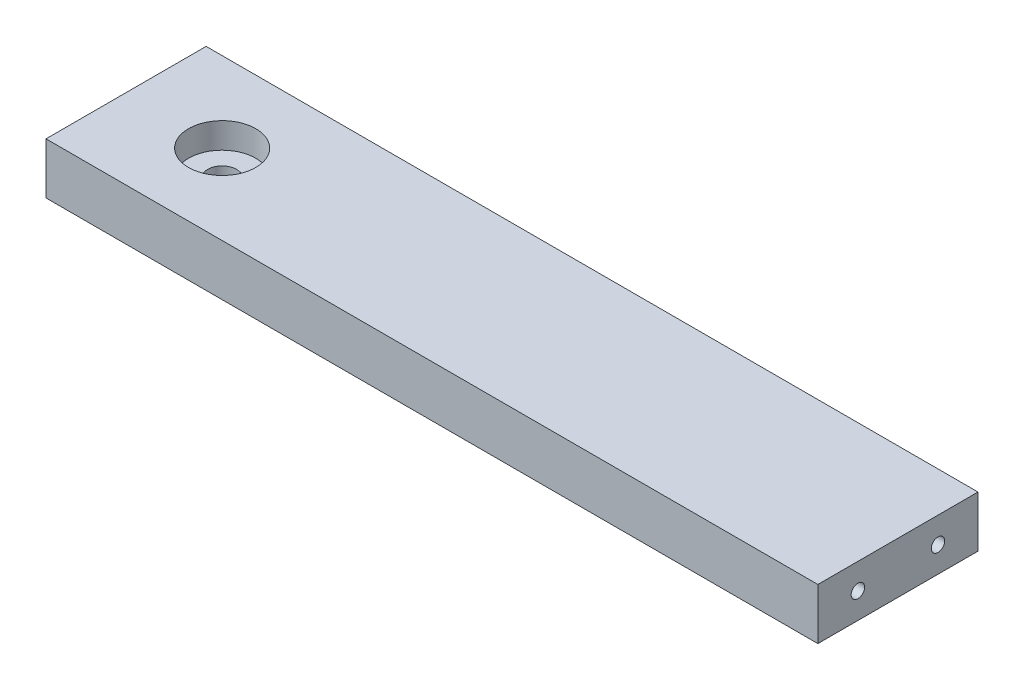
ISO-10303-21;
HEADER;
FILE_DESCRIPTION(('STEP AP214'),'2;1');
FILE_NAME('part.step','',(''),(''),'','','');
FILE_SCHEMA(('AUTOMOTIVE_DESIGN { 1 0 10303 214 1 1 1 1 }'));
ENDSEC;
DATA;
#1=APPLICATION_CONTEXT('core data for automotive mechanical design processes');
#2=APPLICATION_PROTOCOL_DEFINITION('international standard','automotive_design',2000,#1);
#3=PRODUCT_CONTEXT('',#1,'mechanical');
#4=PRODUCT('Part','Part','',(#3));
#5=PRODUCT_RELATED_PRODUCT_CATEGORY('part','',(#4));
#6=PRODUCT_DEFINITION_FORMATION('','',#4);
#7=PRODUCT_DEFINITION_CONTEXT('part definition',#1,'design');
#8=PRODUCT_DEFINITION('design','',#6,#7);
#9=PRODUCT_DEFINITION_SHAPE('','',#8);
#10=(LENGTH_UNIT() NAMED_UNIT(*) SI_UNIT(.MILLI.,.METRE.));
#11=(NAMED_UNIT(*) PLANE_ANGLE_UNIT() SI_UNIT($,.RADIAN.));
#12=(NAMED_UNIT(*) SI_UNIT($,.STERADIAN.) SOLID_ANGLE_UNIT());
#13=UNCERTAINTY_MEASURE_WITH_UNIT(LENGTH_MEASURE(1.E-05),#10,'distance_accuracy_value','');
#14=(GEOMETRIC_REPRESENTATION_CONTEXT(3) GLOBAL_UNCERTAINTY_ASSIGNED_CONTEXT((#13)) GLOBAL_UNIT_ASSIGNED_CONTEXT((#10,
#11,#12)) REPRESENTATION_CONTEXT('',''));
#15=CARTESIAN_POINT('',(0.,0.,0.));
#16=DIRECTION('',(0.,0.,1.));
#17=DIRECTION('',(1.,0.,0.));
#18=AXIS2_PLACEMENT_3D('',#15,#16,#17);
#19=CARTESIAN_POINT('',(-120.5,16.,25.));
#20=DIRECTION('',(1.,0.,0.));
#21=DIRECTION('',(0.,0.,-1.));
#22=AXIS2_PLACEMENT_3D('',#19,#20,#21);
#23=PLANE('',#22);
#24=DIRECTION('',(0.,0.,1.));
#25=VECTOR('',#24,1.);
#26=CARTESIAN_POINT('',(-120.5,0.,25.));
#27=LINE('',#26,#25);
#28=CARTESIAN_POINT('',(-120.5,0.,-25.));
#29=VERTEX_POINT('',#28);
#30=CARTESIAN_POINT('',(-120.5,0.,25.));
#31=VERTEX_POINT('',#30);
#32=EDGE_CURVE('E120',#29,#31,#27,.T.);
#33=ORIENTED_EDGE('',*,*,#32,.T.);
#34=DIRECTION('',(0.,-1.,0.));
#35=VECTOR('',#34,1.);
#36=CARTESIAN_POINT('',(-120.5,16.,25.));
#37=LINE('',#36,#35);
#38=CARTESIAN_POINT('',(-120.5,16.,25.));
#39=VERTEX_POINT('',#38);
#40=EDGE_CURVE('E11',#39,#31,#37,.T.);
#41=ORIENTED_EDGE('',*,*,#40,.F.);
#42=DIRECTION('',(0.,0.,1.));
#43=VECTOR('',#42,1.);
#44=CARTESIAN_POINT('',(-120.5,16.,25.));
#45=LINE('',#44,#43);
#46=CARTESIAN_POINT('',(-120.5,16.,-25.));
#47=VERTEX_POINT('',#46);
#48=EDGE_CURVE('E123',#47,#39,#45,.T.);
#49=ORIENTED_EDGE('',*,*,#48,.F.);
#50=DIRECTION('',(0.,-1.,0.));
#51=VECTOR('',#50,1.);
#52=CARTESIAN_POINT('',(-120.5,16.,-25.));
#53=LINE('',#52,#51);
#54=EDGE_CURVE('E129',#47,#29,#53,.T.);
#55=ORIENTED_EDGE('',*,*,#54,.T.);
#56=EDGE_LOOP('',(#33,#41,#49,#55));
#57=FACE_BOUND('',#56,.T.);
#58=ADVANCED_FACE('F35',(#57),#23,.F.);
#59=CARTESIAN_POINT('',(120.5,16.,25.));
#60=DIRECTION('',(0.,0.,-1.));
#61=DIRECTION('',(-1.,0.,0.));
#62=AXIS2_PLACEMENT_3D('',#59,#60,#61);
#63=PLANE('',#62);
#64=DIRECTION('',(1.,0.,0.));
#65=VECTOR('',#64,1.);
#66=CARTESIAN_POINT('',(120.5,0.,25.));
#67=LINE('',#66,#65);
#68=CARTESIAN_POINT('',(120.5,0.,25.));
#69=VERTEX_POINT('',#68);
#70=EDGE_CURVE('E132',#31,#69,#67,.T.);
#71=ORIENTED_EDGE('',*,*,#70,.T.);
#72=DIRECTION('',(0.,-1.,0.));
#73=VECTOR('',#72,1.);
#74=CARTESIAN_POINT('',(120.5,16.,25.));
#75=LINE('',#74,#73);
#76=CARTESIAN_POINT('',(120.5,16.,25.));
#77=VERTEX_POINT('',#76);
#78=EDGE_CURVE('E43',#77,#69,#75,.T.);
#79=ORIENTED_EDGE('',*,*,#78,.F.);
#80=DIRECTION('',(1.,0.,0.));
#81=VECTOR('',#80,1.);
#82=CARTESIAN_POINT('',(120.5,16.,25.));
#83=LINE('',#82,#81);
#84=EDGE_CURVE('E82',#39,#77,#83,.T.);
#85=ORIENTED_EDGE('',*,*,#84,.F.);
#86=ORIENTED_EDGE('',*,*,#40,.T.);
#87=EDGE_LOOP('',(#71,#79,#85,#86));
#88=FACE_BOUND('',#87,.T.);
#89=ADVANCED_FACE('F156',(#88),#63,.F.);
#90=CARTESIAN_POINT('',(120.5,16.,25.));
#91=DIRECTION('',(-1.,0.,0.));
#92=DIRECTION('',(0.,0.,1.));
#93=AXIS2_PLACEMENT_3D('',#90,#91,#92);
#94=PLANE('',#93);
#95=CARTESIAN_POINT('',(120.5,8.,12.5));
#96=DIRECTION('',(1.,0.,0.));
#97=DIRECTION('',(0.,0.,-1.));
#98=AXIS2_PLACEMENT_3D('',#95,#96,#97);
#99=CIRCLE('',#98,2.09999999999999);
#100=CARTESIAN_POINT('',(120.5,8.,10.4));
#101=VERTEX_POINT('',#100);
#102=EDGE_CURVE('E100',#101,#101,#99,.T.);
#103=ORIENTED_EDGE('',*,*,#102,.F.);
#104=EDGE_LOOP('',(#103));
#105=FACE_BOUND('',#104,.T.);
#106=CARTESIAN_POINT('',(120.5,8.00000000000001,-12.5));
#107=DIRECTION('',(1.,0.,0.));
#108=DIRECTION('',(0.,0.,-1.));
#109=AXIS2_PLACEMENT_3D('',#106,#107,#108);
#110=CIRCLE('',#109,2.09999999999999);
#111=CARTESIAN_POINT('',(120.5,8.00000000000001,-14.6));
#112=VERTEX_POINT('',#111);
#113=EDGE_CURVE('E99',#112,#112,#110,.T.);
#114=ORIENTED_EDGE('',*,*,#113,.F.);
#115=EDGE_LOOP('',(#114));
#116=FACE_BOUND('',#115,.T.);
#117=DIRECTION('',(0.,0.,-1.));
#118=VECTOR('',#117,1.);
#119=CARTESIAN_POINT('',(120.5,0.,25.));
#120=LINE('',#119,#118);
#121=CARTESIAN_POINT('',(120.5,0.,-25.));
#122=VERTEX_POINT('',#121);
#123=EDGE_CURVE('E69',#69,#122,#120,.T.);
#124=ORIENTED_EDGE('',*,*,#123,.T.);
#125=DIRECTION('',(0.,-1.,0.));
#126=VECTOR('',#125,1.);
#127=CARTESIAN_POINT('',(120.5,16.,-25.));
#128=LINE('',#127,#126);
#129=CARTESIAN_POINT('',(120.5,16.,-25.));
#130=VERTEX_POINT('',#129);
#131=EDGE_CURVE('E137',#130,#122,#128,.T.);
#132=ORIENTED_EDGE('',*,*,#131,.F.);
#133=DIRECTION('',(0.,0.,-1.));
#134=VECTOR('',#133,1.);
#135=CARTESIAN_POINT('',(120.5,16.,25.));
#136=LINE('',#135,#134);
#137=EDGE_CURVE('E126',#77,#130,#136,.T.);
#138=ORIENTED_EDGE('',*,*,#137,.F.);
#139=ORIENTED_EDGE('',*,*,#78,.T.);
#140=EDGE_LOOP('',(#124,#132,#138,#139));
#141=FACE_BOUND('',#140,.T.);
#142=ADVANCED_FACE('F139',(#105,#116,#141),#94,.F.);
#143=CARTESIAN_POINT('',(120.5,16.,-25.));
#144=DIRECTION('',(0.,0.,1.));
#145=DIRECTION('',(1.,0.,0.));
#146=AXIS2_PLACEMENT_3D('',#143,#144,#145);
#147=PLANE('',#146);
#148=DIRECTION('',(-1.,0.,0.));
#149=VECTOR('',#148,1.);
#150=CARTESIAN_POINT('',(120.5,0.,-25.));
#151=LINE('',#150,#149);
#152=EDGE_CURVE('E75',#122,#29,#151,.T.);
#153=ORIENTED_EDGE('',*,*,#152,.T.);
#154=ORIENTED_EDGE('',*,*,#54,.F.);
#155=DIRECTION('',(-1.,0.,0.));
#156=VECTOR('',#155,1.);
#157=CARTESIAN_POINT('',(120.5,16.,-25.));
#158=LINE('',#157,#156);
#159=EDGE_CURVE('E51',#130,#47,#158,.T.);
#160=ORIENTED_EDGE('',*,*,#159,.F.);
#161=ORIENTED_EDGE('',*,*,#131,.T.);
#162=EDGE_LOOP('',(#153,#154,#160,#161));
#163=FACE_BOUND('',#162,.T.);
#164=ADVANCED_FACE('F146',(#163),#147,.F.);
#165=CARTESIAN_POINT('',(0.,16.,0.));
#166=DIRECTION('',(0.,1.,0.));
#167=DIRECTION('',(0.,0.,1.));
#168=AXIS2_PLACEMENT_3D('',#165,#166,#167);
#169=PLANE('',#168);
#170=CARTESIAN_POINT('',(-90.5,16.,0.));
#171=DIRECTION('',(0.,1.,0.));
#172=DIRECTION('',(0.,0.,1.));
#173=AXIS2_PLACEMENT_3D('',#170,#171,#172);
#174=CIRCLE('',#173,10.5);
#175=CARTESIAN_POINT('',(-90.5,16.,10.5));
#176=VERTEX_POINT('',#175);
#177=EDGE_CURVE('E114',#176,#176,#174,.T.);
#178=ORIENTED_EDGE('',*,*,#177,.F.);
#179=EDGE_LOOP('',(#178));
#180=FACE_BOUND('',#179,.T.);
#181=ORIENTED_EDGE('',*,*,#48,.T.);
#182=ORIENTED_EDGE('',*,*,#84,.T.);
#183=ORIENTED_EDGE('',*,*,#137,.T.);
#184=ORIENTED_EDGE('',*,*,#159,.T.);
#185=EDGE_LOOP('',(#181,#182,#183,#184));
#186=FACE_BOUND('',#185,.T.);
#187=ADVANCED_FACE('F148',(#180,#186),#169,.T.);
#188=CARTESIAN_POINT('',(0.,0.,0.));
#189=DIRECTION('',(0.,1.,0.));
#190=DIRECTION('',(0.,0.,1.));
#191=AXIS2_PLACEMENT_3D('',#188,#189,#190);
#192=PLANE('',#191);
#193=CARTESIAN_POINT('',(-90.5,0.,0.));
#194=DIRECTION('',(0.,1.,0.));
#195=DIRECTION('',(0.,0.,1.));
#196=AXIS2_PLACEMENT_3D('',#193,#194,#195);
#197=CIRCLE('',#196,4.5);
#198=CARTESIAN_POINT('',(-90.5,0.,4.49999999999999));
#199=VERTEX_POINT('',#198);
#200=EDGE_CURVE('E111',#199,#199,#197,.T.);
#201=ORIENTED_EDGE('',*,*,#200,.T.);
#202=EDGE_LOOP('',(#201));
#203=FACE_BOUND('',#202,.T.);
#204=ORIENTED_EDGE('',*,*,#32,.F.);
#205=ORIENTED_EDGE('',*,*,#152,.F.);
#206=ORIENTED_EDGE('',*,*,#123,.F.);
#207=ORIENTED_EDGE('',*,*,#70,.F.);
#208=EDGE_LOOP('',(#204,#205,#206,#207));
#209=FACE_BOUND('',#208,.T.);
#210=ADVANCED_FACE('F142',(#203,#209),#192,.F.);
#211=CARTESIAN_POINT('',(-90.5,8.,0.));
#212=DIRECTION('',(0.,1.,0.));
#213=DIRECTION('',(0.,0.,1.));
#214=AXIS2_PLACEMENT_3D('',#211,#212,#213);
#215=CYLINDRICAL_SURFACE('',#214,10.5);
#216=CARTESIAN_POINT('',(-90.5,8.,0.));
#217=DIRECTION('',(0.,1.,0.));
#218=DIRECTION('',(0.,0.,1.));
#219=AXIS2_PLACEMENT_3D('',#216,#217,#218);
#220=CIRCLE('',#219,10.5);
#221=CARTESIAN_POINT('',(-90.5,8.,10.5));
#222=VERTEX_POINT('',#221);
#223=EDGE_CURVE('E117',#222,#222,#220,.T.);
#224=ORIENTED_EDGE('',*,*,#223,.F.);
#225=EDGE_LOOP('',(#224));
#226=FACE_BOUND('',#225,.T.);
#227=ORIENTED_EDGE('',*,*,#177,.T.);
#228=EDGE_LOOP('',(#227));
#229=FACE_BOUND('',#228,.T.);
#230=ADVANCED_FACE('F221',(#226,#229),#215,.F.);
#231=CARTESIAN_POINT('',(-90.5,8.,0.));
#232=DIRECTION('',(0.,1.,0.));
#233=DIRECTION('',(0.,0.,1.));
#234=AXIS2_PLACEMENT_3D('',#231,#232,#233);
#235=PLANE('',#234);
#236=CARTESIAN_POINT('',(-90.5,8.,0.));
#237=DIRECTION('',(0.,1.,0.));
#238=DIRECTION('',(0.,0.,1.));
#239=AXIS2_PLACEMENT_3D('',#236,#237,#238);
#240=CIRCLE('',#239,4.5);
#241=CARTESIAN_POINT('',(-90.5,8.,4.49999999999999));
#242=VERTEX_POINT('',#241);
#243=EDGE_CURVE('E110',#242,#242,#240,.T.);
#244=ORIENTED_EDGE('',*,*,#243,.F.);
#245=EDGE_LOOP('',(#244));
#246=FACE_BOUND('',#245,.T.);
#247=ORIENTED_EDGE('',*,*,#223,.T.);
#248=EDGE_LOOP('',(#247));
#249=FACE_BOUND('',#248,.T.);
#250=ADVANCED_FACE('F217',(#246,#249),#235,.T.);
#251=CARTESIAN_POINT('',(-90.5,0.,0.));
#252=DIRECTION('',(0.,1.,0.));
#253=DIRECTION('',(0.,0.,1.));
#254=AXIS2_PLACEMENT_3D('',#251,#252,#253);
#255=CYLINDRICAL_SURFACE('',#254,4.5);
#256=ORIENTED_EDGE('',*,*,#200,.F.);
#257=EDGE_LOOP('',(#256));
#258=FACE_BOUND('',#257,.T.);
#259=ORIENTED_EDGE('',*,*,#243,.T.);
#260=EDGE_LOOP('',(#259));
#261=FACE_BOUND('',#260,.T.);
#262=ADVANCED_FACE('F177',(#258,#261),#255,.F.);
#263=CARTESIAN_POINT('',(98.1,8.00000000000001,-12.5));
#264=DIRECTION('',(1.,0.,0.));
#265=DIRECTION('',(0.,0.,-1.));
#266=AXIS2_PLACEMENT_3D('',#263,#264,#265);
#267=CONICAL_SURFACE('',#266,2.09999999999999,1.02974425867665);
#268=CARTESIAN_POINT('',(96.8381927000421,8.,-12.5));
#269=VERTEX_POINT('',#268);
#270=VERTEX_LOOP('',#269);
#271=FACE_BOUND('',#270,.T.);
#272=CARTESIAN_POINT('',(98.1,8.00000000000001,-12.5));
#273=DIRECTION('',(1.,0.,0.));
#274=DIRECTION('',(0.,0.,-1.));
#275=AXIS2_PLACEMENT_3D('',#272,#273,#274);
#276=CIRCLE('',#275,2.09999999999999);
#277=CARTESIAN_POINT('',(98.1,8.00000000000001,-14.6));
#278=VERTEX_POINT('',#277);
#279=EDGE_CURVE('E103',#278,#278,#276,.T.);
#280=ORIENTED_EDGE('',*,*,#279,.T.);
#281=EDGE_LOOP('',(#280));
#282=FACE_BOUND('',#281,.T.);
#283=ADVANCED_FACE('F182',(#271,#282),#267,.F.);
#284=CARTESIAN_POINT('',(120.5,8.00000000000001,-12.5));
#285=DIRECTION('',(1.,0.,0.));
#286=DIRECTION('',(0.,0.,-1.));
#287=AXIS2_PLACEMENT_3D('',#284,#285,#286);
#288=CYLINDRICAL_SURFACE('',#287,2.09999999999999);
#289=ORIENTED_EDGE('',*,*,#279,.F.);
#290=EDGE_LOOP('',(#289));
#291=FACE_BOUND('',#290,.T.);
#292=ORIENTED_EDGE('',*,*,#113,.T.);
#293=EDGE_LOOP('',(#292));
#294=FACE_BOUND('',#293,.T.);
#295=ADVANCED_FACE('F93',(#291,#294),#288,.F.);
#296=CARTESIAN_POINT('',(98.1,8.,12.5));
#297=DIRECTION('',(1.,0.,0.));
#298=DIRECTION('',(0.,0.,-1.));
#299=AXIS2_PLACEMENT_3D('',#296,#297,#298);
#300=CONICAL_SURFACE('',#299,2.09999999999999,1.02974425867665);
#301=CARTESIAN_POINT('',(96.8381927000421,7.99999999999999,12.5));
#302=VERTEX_POINT('',#301);
#303=VERTEX_LOOP('',#302);
#304=FACE_BOUND('',#303,.T.);
#305=CARTESIAN_POINT('',(98.1,8.,12.5));
#306=DIRECTION('',(1.,0.,0.));
#307=DIRECTION('',(0.,0.,-1.));
#308=AXIS2_PLACEMENT_3D('',#305,#306,#307);
#309=CIRCLE('',#308,2.09999999999999);
#310=CARTESIAN_POINT('',(98.1,8.,10.4));
#311=VERTEX_POINT('',#310);
#312=EDGE_CURVE('E97',#311,#311,#309,.T.);
#313=ORIENTED_EDGE('',*,*,#312,.T.);
#314=EDGE_LOOP('',(#313));
#315=FACE_BOUND('',#314,.T.);
#316=ADVANCED_FACE('F89',(#304,#315),#300,.F.);
#317=CARTESIAN_POINT('',(120.5,8.,12.5));
#318=DIRECTION('',(1.,0.,0.));
#319=DIRECTION('',(0.,0.,-1.));
#320=AXIS2_PLACEMENT_3D('',#317,#318,#319);
#321=CYLINDRICAL_SURFACE('',#320,2.09999999999999);
#322=ORIENTED_EDGE('',*,*,#312,.F.);
#323=EDGE_LOOP('',(#322));
#324=FACE_BOUND('',#323,.T.);
#325=ORIENTED_EDGE('',*,*,#102,.T.);
#326=EDGE_LOOP('',(#325));
#327=FACE_BOUND('',#326,.T.);
#328=ADVANCED_FACE('F92',(#324,#327),#321,.F.);
#329=CLOSED_SHELL('',(#58,#89,#142,#164,#187,#210,#230,#250,#262,#283,#295,#316,#328));
#330=MANIFOLD_SOLID_BREP('B2',#329);
#331=ADVANCED_BREP_SHAPE_REPRESENTATION('',(#18,#330),#14);
#332=SHAPE_DEFINITION_REPRESENTATION(#9,#331);
ENDSEC;
END-ISO-10303-21;
